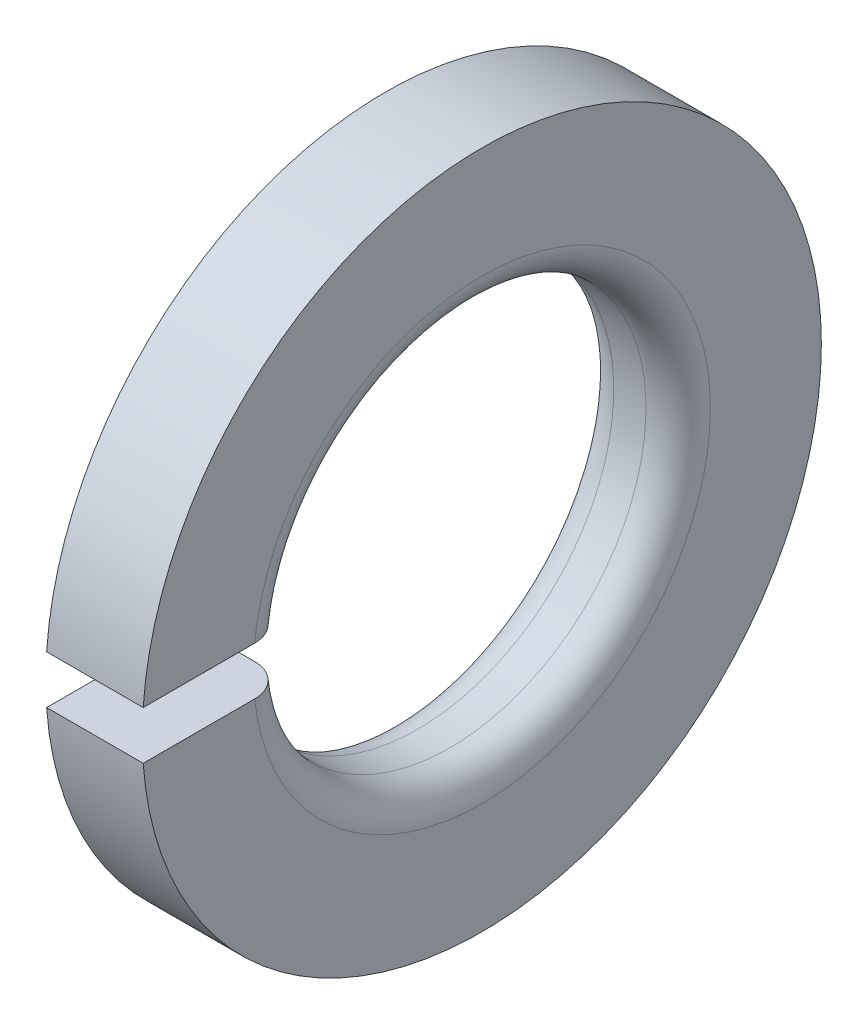
ISO-10303-21;
HEADER;
FILE_DESCRIPTION(('STEP AP214'),'2;1');
FILE_NAME('part.step','',(''),(''),'','','');
FILE_SCHEMA(('AUTOMOTIVE_DESIGN { 1 0 10303 214 1 1 1 1 }'));
ENDSEC;
DATA;
#1=APPLICATION_CONTEXT('core data for automotive mechanical design processes');
#2=APPLICATION_PROTOCOL_DEFINITION('international standard','automotive_design',2000,#1);
#3=PRODUCT_CONTEXT('',#1,'mechanical');
#4=PRODUCT('Part','Part','',(#3));
#5=PRODUCT_RELATED_PRODUCT_CATEGORY('part','',(#4));
#6=PRODUCT_DEFINITION_FORMATION('','',#4);
#7=PRODUCT_DEFINITION_CONTEXT('part definition',#1,'design');
#8=PRODUCT_DEFINITION('design','',#6,#7);
#9=PRODUCT_DEFINITION_SHAPE('','',#8);
#10=(LENGTH_UNIT() NAMED_UNIT(*) SI_UNIT(.MILLI.,.METRE.));
#11=(NAMED_UNIT(*) PLANE_ANGLE_UNIT() SI_UNIT($,.RADIAN.));
#12=(NAMED_UNIT(*) SI_UNIT($,.STERADIAN.) SOLID_ANGLE_UNIT());
#13=UNCERTAINTY_MEASURE_WITH_UNIT(LENGTH_MEASURE(1.E-05),#10,'distance_accuracy_value','');
#14=(GEOMETRIC_REPRESENTATION_CONTEXT(3) GLOBAL_UNCERTAINTY_ASSIGNED_CONTEXT((#13)) GLOBAL_UNIT_ASSIGNED_CONTEXT((#10,
#11,#12)) REPRESENTATION_CONTEXT('',''));
#15=CARTESIAN_POINT('',(0.,0.,0.));
#16=DIRECTION('',(0.,0.,1.));
#17=DIRECTION('',(1.,0.,0.));
#18=AXIS2_PLACEMENT_3D('',#15,#16,#17);
#19=CARTESIAN_POINT('',(-34.925,0.,0.));
#20=DIRECTION('',(-1.,0.,0.));
#21=DIRECTION('',(0.,0.,1.));
#22=AXIS2_PLACEMENT_3D('',#19,#20,#21);
#23=CYLINDRICAL_SURFACE('',#22,10.55);
#24=DIRECTION('',(-1.,0.,0.));
#25=VECTOR('',#24,1.);
#26=CARTESIAN_POINT('',(-34.9250000000012,0.749999999999584,10.5233074648624));
#27=LINE('',#26,#25);
#28=CARTESIAN_POINT('',(0.,0.749999999999917,10.5233074648611));
#29=VERTEX_POINT('',#28);
#30=CARTESIAN_POINT('',(-3.00000000000012,0.750000000000473,10.5233074648618));
#31=VERTEX_POINT('',#30);
#32=EDGE_CURVE('E343',#29,#31,#27,.T.);
#33=ORIENTED_EDGE('',*,*,#32,.F.);
#34=CARTESIAN_POINT('',(0.,0.,0.));
#35=DIRECTION('',(-1.,0.,0.));
#36=DIRECTION('',(0.,0.,1.));
#37=AXIS2_PLACEMENT_3D('',#34,#35,#36);
#38=CIRCLE('',#37,10.55);
#39=CARTESIAN_POINT('',(-8.88178419700125E-13,-0.749999999999695,10.5233074648613));
#40=VERTEX_POINT('',#39);
#41=EDGE_CURVE('E11',#29,#40,#38,.T.);
#42=ORIENTED_EDGE('',*,*,#41,.T.);
#43=DIRECTION('',(1.,0.,0.));
#44=VECTOR('',#43,1.);
#45=CARTESIAN_POINT('',(-34.9250000000012,-0.750000000000029,10.5233074648615));
#46=LINE('',#45,#44);
#47=CARTESIAN_POINT('',(-2.99999999999967,-0.749999999999473,10.5233074648614));
#48=VERTEX_POINT('',#47);
#49=EDGE_CURVE('E342',#48,#40,#46,.T.);
#50=ORIENTED_EDGE('',*,*,#49,.F.);
#51=CARTESIAN_POINT('',(-3.00000000000145,1.66533453693774E-12,1.11022302462516E-13));
#52=DIRECTION('',(-1.,0.,0.));
#53=DIRECTION('',(0.,0.,1.));
#54=AXIS2_PLACEMENT_3D('',#51,#52,#53);
#55=CIRCLE('',#54,10.55);
#56=EDGE_CURVE('E147',#31,#48,#55,.T.);
#57=ORIENTED_EDGE('',*,*,#56,.F.);
#58=EDGE_LOOP('',(#33,#42,#50,#57));
#59=FACE_BOUND('',#58,.T.);
#60=ADVANCED_FACE('F17',(#59),#23,.T.);
#61=CARTESIAN_POINT('',(0.,7.1,1.11022302462516E-13));
#62=DIRECTION('',(-1.,0.,0.));
#63=DIRECTION('',(0.,0.,1.));
#64=AXIS2_PLACEMENT_3D('',#61,#62,#63);
#65=PLANE('',#64);
#66=DIRECTION('',(0.,0.,-1.));
#67=VECTOR('',#66,1.);
#68=CARTESIAN_POINT('',(-8.88178419700125E-13,0.750000000000029,10.761));
#69=LINE('',#68,#67);
#70=CARTESIAN_POINT('',(0.,0.750000000000029,7.06027619856342));
#71=VERTEX_POINT('',#70);
#72=EDGE_CURVE('E352',#29,#71,#69,.T.);
#73=ORIENTED_EDGE('',*,*,#72,.T.);
#74=CARTESIAN_POINT('',(0.,0.,0.));
#75=DIRECTION('',(-1.,0.,0.));
#76=DIRECTION('',(0.,0.,1.));
#77=AXIS2_PLACEMENT_3D('',#74,#75,#76);
#78=CIRCLE('',#77,7.1);
#79=CARTESIAN_POINT('',(0.,-0.749999999999806,7.06027619856287));
#80=VERTEX_POINT('',#79);
#81=EDGE_CURVE('E29',#71,#80,#78,.T.);
#82=ORIENTED_EDGE('',*,*,#81,.T.);
#83=DIRECTION('',(0.,0.,1.));
#84=VECTOR('',#83,1.);
#85=CARTESIAN_POINT('',(0.,-0.749999999999806,0.));
#86=LINE('',#85,#84);
#87=EDGE_CURVE('E115',#80,#40,#86,.T.);
#88=ORIENTED_EDGE('',*,*,#87,.T.);
#89=ORIENTED_EDGE('',*,*,#41,.F.);
#90=EDGE_LOOP('',(#73,#82,#88,#89));
#91=FACE_BOUND('',#90,.T.);
#92=ADVANCED_FACE('F19',(#91),#65,.F.);
#93=CARTESIAN_POINT('',(-1.00000000000122,3.33066907387547E-13,3.33066907387547E-13));
#94=DIRECTION('',(-1.,0.,0.));
#95=DIRECTION('',(0.,0.,1.));
#96=AXIS2_PLACEMENT_3D('',#93,#94,#95);
#97=TOROIDAL_SURFACE('',#96,7.1,1.);
#98=ORIENTED_EDGE('',*,*,#81,.F.);
#99=CARTESIAN_POINT('',(-1.2041149327624E-12,0.750000000000028,7.06027619856342));
#100=CARTESIAN_POINT('',(2.11423307981997E-08,0.750008037936545,7.05364805238839));
#101=CARTESIAN_POINT('',(-6.5138820977953E-05,0.750018129071714,7.04701960641984));
#102=CARTESIAN_POINT('',(-0.000445506639455228,0.750049929015512,7.02767221302381));
#103=CARTESIAN_POINT('',(-0.000935521628921882,0.750073789508414,7.01495631251578));
#104=CARTESIAN_POINT('',(-0.00216099125794257,0.750103964057556,6.9936224435503));
#105=CARTESIAN_POINT('',(-0.00276751760387173,0.750113450510542,6.98499676452231));
#106=CARTESIAN_POINT('',(-0.0043278318197273,0.750130214250066,6.96624579931448));
#107=CARTESIAN_POINT('',(-0.0053239690908946,0.750136808076614,6.95612399142267));
#108=CARTESIAN_POINT('',(-0.00779302574358655,0.750145614820519,6.93440194389385));
#109=CARTESIAN_POINT('',(-0.00931500233512231,0.750147023917739,6.92280726977953));
#110=CARTESIAN_POINT('',(-0.0129844047822201,0.750144554799812,6.89817165380968));
#111=CARTESIAN_POINT('',(-0.0151874654477161,0.750139964242043,6.88513897448243));
#112=CARTESIAN_POINT('',(-0.020385788111291,0.750125385232084,6.85767422063468));
#113=CARTESIAN_POINT('',(-0.023443069404395,0.750114835946151,6.84325386262928));
#114=CARTESIAN_POINT('',(-0.0305331728168089,0.750090038524818,6.81307884826635));
#115=CARTESIAN_POINT('',(-0.0346341302398465,0.750075520931053,6.79734016930507));
#116=CARTESIAN_POINT('',(-0.0440092876829131,0.750045738582378,6.76461623018628));
#117=CARTESIAN_POINT('',(-0.0493573624811857,0.750030531020999,6.74765212400548));
#118=CARTESIAN_POINT('',(-0.0614364981100349,0.750008606357445,6.71259035766385));
#119=CARTESIAN_POINT('',(-0.0682467268683557,0.750002726796111,6.69451985991343));
#120=CARTESIAN_POINT('',(-0.0805636257028954,0.749998139446048,6.66447474261093));
#121=CARTESIAN_POINT('',(-0.085797125781996,0.749997746706142,6.65238725585513));
#122=CARTESIAN_POINT('',(-0.096564212911749,0.74999324765076,6.62879593541076));
#123=CARTESIAN_POINT('',(-0.102083541699873,0.749989256391272,6.61728560510652));
#124=CARTESIAN_POINT('',(-0.113371888865033,0.74998128544142,6.59484584653299));
#125=CARTESIAN_POINT('',(-0.119127351407494,0.749977309433134,6.58390959395909));
#126=CARTESIAN_POINT('',(-0.130840120725573,0.749969864119182,6.56261201264376));
#127=CARTESIAN_POINT('',(-0.136784558829839,0.749966382447419,6.55224360597533));
#128=CARTESIAN_POINT('',(-0.148829677858792,0.749960771596652,6.53207347879412));
#129=CARTESIAN_POINT('',(-0.154918170472224,0.749958600449177,6.52226447788853));
#130=CARTESIAN_POINT('',(-0.167208177496439,0.749955929611172,6.5032028000474));
#131=CARTESIAN_POINT('',(-0.17339817144826,0.749955373780526,6.49394269380808));
#132=CARTESIAN_POINT('',(-0.185850334077228,0.749955987479875,6.47596664955041));
#133=CARTESIAN_POINT('',(-0.192101636110495,0.749957094820871,6.46724318256392));
#134=CARTESIAN_POINT('',(-0.20463794413301,0.74996079457746,6.45032673203549));
#135=CARTESIAN_POINT('',(-0.21091272110423,0.749963329204107,6.44212616650714));
#136=CARTESIAN_POINT('',(-0.223459865779099,0.749969393821079,6.42624056403475));
#137=CARTESIAN_POINT('',(-0.229722624155955,0.749972880748052,6.41854793584713));
#138=CARTESIAN_POINT('',(-0.242211926815478,0.749980134744804,6.40366223906435));
#139=CARTESIAN_POINT('',(-0.248429462668517,0.749983884508126,6.39646161038275));
#140=CARTESIAN_POINT('',(-0.260796819415206,0.74999075578992,6.38254311618097));
#141=CARTESIAN_POINT('',(-0.266938211030566,0.749993897287116,6.37581776104531));
#142=CARTESIAN_POINT('',(-0.279123861359696,0.749998464356577,6.3628325533268));
#143=CARTESIAN_POINT('',(-0.285160254244034,0.749999960151965,6.35656531170203));
#144=CARTESIAN_POINT('',(-0.299781099102845,0.750000055397179,6.34177533362768));
#145=CARTESIAN_POINT('',(-0.308440744744657,0.749997296983446,6.33332670620505));
#146=CARTESIAN_POINT('',(-0.325986854869242,0.749987542607557,6.31681723310449));
#147=CARTESIAN_POINT('',(-0.334870841593646,0.749980581990885,6.30875375180008));
#148=CARTESIAN_POINT('',(-0.352847247959955,0.749963712506177,6.29301694327239));
#149=CARTESIAN_POINT('',(-0.361937306871138,0.749953828749099,6.28534091982272));
#150=CARTESIAN_POINT('',(-0.380307533792174,0.749932274552667,6.27038077865991));
#151=CARTESIAN_POINT('',(-0.389585460080683,0.749920619838264,6.26309390794446));
#152=CARTESIAN_POINT('',(-0.408313440867343,0.749896541627526,6.24891296706047));
#153=CARTESIAN_POINT('',(-0.417761372334003,0.749884125477424,6.24201609304799));
#154=CARTESIAN_POINT('',(-0.436811688573136,0.749859405250485,6.22861528610179));
#155=CARTESIAN_POINT('',(-0.446412069008523,0.749847101120888,6.22210850371771));
#156=CARTESIAN_POINT('',(-0.465749958551137,0.749823349867244,6.20948727984532));
#157=CARTESIAN_POINT('',(-0.475485581657837,0.74981189629012,6.20336994857705));
#158=CARTESIAN_POINT('',(-0.495077002164332,0.749790458163845,6.19152632362359));
#159=CARTESIAN_POINT('',(-0.504931031375656,0.749780461763541,6.18579710494295));
#160=CARTESIAN_POINT('',(-0.524742703631445,0.74976242001739,6.17472773027463));
#161=CARTESIAN_POINT('',(-0.534698695568911,0.749754358429363,6.16938461907566));
#162=CARTESIAN_POINT('',(-0.554698146737854,0.749740541645805,6.15908484623193));
#163=CARTESIAN_POINT('',(-0.564740071030225,0.749734766825856,6.15412520402685));
#164=CARTESIAN_POINT('',(-0.584895672640169,0.749725755765443,6.14458915068896));
#165=CARTESIAN_POINT('',(-0.59500793009622,0.749722497527077,6.14000973838084));
#166=CARTESIAN_POINT('',(-0.615288932272613,0.749718632443541,6.1312303539494));
#167=CARTESIAN_POINT('',(-0.62545637095254,0.749718002233714,6.12702736463286));
#168=CARTESIAN_POINT('',(-0.64583293264701,0.749719390631004,6.11899649562263));
#169=CARTESIAN_POINT('',(-0.656040862028827,0.749721385509608,6.11516558717549));
#170=CARTESIAN_POINT('',(-0.676484077465172,0.749727910284104,6.10787404214419));
#171=CARTESIAN_POINT('',(-0.686718280733683,0.749732417084971,6.10441036956231));
#172=CARTESIAN_POINT('',(-0.707200202174703,0.749743745006644,6.09784798343645));
#173=CARTESIAN_POINT('',(-0.717446946708477,0.749750544656072,6.09474623082294));
#174=CARTESIAN_POINT('',(-0.737940603683841,0.74976613513961,6.08890192845629));
#175=CARTESIAN_POINT('',(-0.748186649805068,0.749774907107453,6.08615634058943));
#176=CARTESIAN_POINT('',(-0.768666064936576,0.749794021233457,6.08101819942575));
#177=CARTESIAN_POINT('',(-0.778898672995217,0.749804348101752,6.07862261285264));
#178=CARTESIAN_POINT('',(-0.799338874556187,0.749826057824054,6.07417792451807));
#179=CARTESIAN_POINT('',(-0.809545810413815,0.749837429924567,6.07212579805322));
#180=CARTESIAN_POINT('',(-0.829922841778302,0.749860627495553,6.06836112891827));
#181=CARTESIAN_POINT('',(-0.840092380781704,0.749872447695563,6.0666455737052));
#182=CARTESIAN_POINT('',(-0.860383306856754,0.74989585499694,6.06354682372122));
#183=CARTESIAN_POINT('',(-0.870504236305252,0.749907443245808,6.0621606320133));
#184=CARTESIAN_POINT('',(-0.89068714727635,0.749929621988156,6.05971309388315));
#185=CARTESIAN_POINT('',(-0.900748767705977,0.74994022095905,6.05864876941193));
#186=CARTESIAN_POINT('',(-0.920802779557631,0.749959580027983,6.05683718006757));
#187=CARTESIAN_POINT('',(-0.930794903992257,0.749968356859051,6.05608695923404));
#188=CARTESIAN_POINT('',(-0.950700158460559,0.74998317033175,6.05489557274971));
#189=CARTESIAN_POINT('',(-0.960613113094895,0.749989232760618,6.05445147604589));
#190=CARTESIAN_POINT('',(-0.980350767955612,0.749997618688641,6.05386405048746));
#191=CARTESIAN_POINT('',(-0.990175381863722,0.749999978218759,6.05371781904315));
#192=CARTESIAN_POINT('',(-1.00000000000121,0.749999999999889,6.05371786590726));
#193=B_SPLINE_CURVE_WITH_KNOTS('',3,(#99,#100,#101,#102,#103,#104,#105,#106,#107,#108,#109,#110,
#111,#112,#113,#114,#115,#116,#117,#118,#119,#120,#121,#122,#123,#124,#125,#126,#127,#128,#129,
#130,#131,#132,#133,#134,#135,#136,#137,#138,#139,#140,#141,#142,#143,#144,#145,#146,#147,#148,
#149,#150,#151,#152,#153,#154,#155,#156,#157,#158,#159,#160,#161,#162,#163,#164,#165,#166,#167,
#168,#169,#170,#171,#172,#173,#174,#175,#176,#177,#178,#179,#180,#181,#182,#183,#184,#185,#186,
#187,#188,#189,#190,#191,#192),.UNSPECIFIED.,.F.,.F.,(4,2,2,2,2,2,2,2,2,2,2,2,2,2,2,2,2,2,2,2,2,
2,2,2,2,2,2,2,2,2,2,2,2,2,2,2,2,2,2,2,2,2,2,2,2,2,4),(0.,0.0198848844077795,0.05805079897902,
0.083989284224621,0.114496655421104,0.149572083118762,0.189214626023075,0.233423238921282,
0.282196783078135,0.335534039528537,0.393433725662494,0.432939987603925,0.47122622993429,
0.508292782305171,0.544139958379165,0.578768056426907,0.612177360131367,0.644368139593511,
0.675340652539823,0.705095145740162,0.733631856654177,0.760951015337154,0.787052846652623,
0.823339391841095,0.859324895904127,0.895009830030772,0.930394655814464,0.965479825985928,
1.00026578519895,1.03475297086513,1.06894181403409,1.10283274031573,1.13642617084169,
1.16972252326329,1.20272221278343,1.23542565322055,1.26783325810255,1.29994544178923,
1.33176262062186,1.36328521409865,1.39451364607533,1.42544834599017,1.45608975011279,
1.48643830281662,1.51649445787486,1.54625867977995,1.57573144508685),.UNSPECIFIED.);
#194=CARTESIAN_POINT('',(-1.00000000000078,0.749999999999806,6.05371786590658));
#195=VERTEX_POINT('',#194);
#196=EDGE_CURVE('E91',#71,#195,#193,.T.);
#197=ORIENTED_EDGE('',*,*,#196,.T.);
#198=CARTESIAN_POINT('',(-1.00000000000122,3.33066907387547E-13,3.33066907387547E-13));
#199=DIRECTION('',(-1.,0.,0.));
#200=DIRECTION('',(0.,0.,1.));
#201=AXIS2_PLACEMENT_3D('',#198,#199,#200);
#202=CIRCLE('',#201,6.1);
#203=CARTESIAN_POINT('',(-0.99999999999989,-0.749999999999584,6.05371786590669));
#204=VERTEX_POINT('',#203);
#205=EDGE_CURVE('E84',#195,#204,#202,.T.);
#206=ORIENTED_EDGE('',*,*,#205,.T.);
#207=CARTESIAN_POINT('',(-1.00000000000122,-0.749999999999655,6.0537178659072));
#208=CARTESIAN_POINT('',(-0.98864580629994,-0.74999983871679,6.0537177933391));
#209=CARTESIAN_POINT('',(-0.977291637226825,-0.74998842317375,6.05391415055511));
#210=CARTESIAN_POINT('',(-0.954273521757971,-0.749947517721484,6.05470961881993));
#211=CARTESIAN_POINT('',(-0.94260996621021,-0.74991752211604,6.0553200454697));
#212=CARTESIAN_POINT('',(-0.918988745261551,-0.749843455769734,6.05697637438166));
#213=CARTESIAN_POINT('',(-0.907031894416854,-0.749799017737892,6.05803388469803));
#214=CARTESIAN_POINT('',(-0.88284215737576,-0.749699769780837,6.06061725344128));
#215=CARTESIAN_POINT('',(-0.870610540241056,-0.749644712091877,6.06215499242686));
#216=CARTESIAN_POINT('',(-0.845891924764115,-0.749527905027171,6.06573182138134));
#217=CARTESIAN_POINT('',(-0.833406682218283,-0.749466017627301,6.06778304605382));
#218=CARTESIAN_POINT('',(-0.808204168231223,-0.749339089359824,6.07241976557473));
#219=CARTESIAN_POINT('',(-0.79548917141209,-0.749274008323552,6.07501762733141));
#220=CARTESIAN_POINT('',(-0.769853323980096,-0.749144077073757,6.08078027405549));
#221=CARTESIAN_POINT('',(-0.756935298937043,-0.749079273509318,6.08395763384425));
#222=CARTESIAN_POINT('',(-0.730922504553121,-0.748953083411957,6.09091144912769));
#223=CARTESIAN_POINT('',(-0.717831143562997,-0.748891819271141,6.0947006602152));
#224=CARTESIAN_POINT('',(-0.691503822617773,-0.748775658789017,6.10290964108203));
#225=CARTESIAN_POINT('',(-0.678271885134138,-0.748720949641896,6.10734231721819));
#226=CARTESIAN_POINT('',(-0.651698680210438,-0.748620573250317,6.11686873307185));
#227=CARTESIAN_POINT('',(-0.638362079954005,-0.74857514709261,6.12197549690525));
#228=CARTESIAN_POINT('',(-0.611618014554271,-0.748495692259896,6.13287936815752));
#229=CARTESIAN_POINT('',(-0.59821589088877,-0.748461947670379,6.13868958136597));
#230=CARTESIAN_POINT('',(-0.571382494288149,-0.748407849956561,6.15102812136404));
#231=CARTESIAN_POINT('',(-0.557957265417688,-0.748387813010919,6.15756959637456));
#232=CARTESIAN_POINT('',(-0.5311226587416,-0.748362719213466,6.17139661708041));
#233=CARTESIAN_POINT('',(-0.517720054295375,-0.748357999703219,6.1786953109725));
#234=CARTESIAN_POINT('',(-0.490978992823964,-0.748364679895013,6.19406059369174));
#235=CARTESIAN_POINT('',(-0.477648063264032,-0.748376427140605,6.20214028498603));
#236=CARTESIAN_POINT('',(-0.451101929769764,-0.748416686307562,6.219088917855));
#237=CARTESIAN_POINT('',(-0.437895029993027,-0.748445544985654,6.2279708671976));
#238=CARTESIAN_POINT('',(-0.411651773796662,-0.748520135128423,6.24654255172851));
#239=CARTESIAN_POINT('',(-0.398624518245661,-0.748566201557073,6.25624514776224));
#240=CARTESIAN_POINT('',(-0.372798534587934,-0.74867473519741,6.27647347735246));
#241=CARTESIAN_POINT('',(-0.360009721154046,-0.748737514576063,6.28701186939311));
#242=CARTESIAN_POINT('',(-0.334721665455284,-0.748878380706492,6.3089235833416));
#243=CARTESIAN_POINT('',(-0.322233165464315,-0.748956745852301,6.3203093027859));
#244=CARTESIAN_POINT('',(-0.297609697050328,-0.749127029457294,6.34392352013707));
#245=CARTESIAN_POINT('',(-0.285486308619727,-0.749219181624383,6.35616409300119));
#246=CARTESIAN_POINT('',(-0.261659758676289,-0.749414587988212,6.38149153096655));
#247=CARTESIAN_POINT('',(-0.249969020921282,-0.74951802039829,6.39459008390115));
#248=CARTESIAN_POINT('',(-0.227076979280183,-0.749732805496878,6.42163226756731));
#249=CARTESIAN_POINT('',(-0.215888944487963,-0.749844270249991,6.43558713174588));
#250=CARTESIAN_POINT('',(-0.194073761385874,-0.750071178593424,6.46433559803284));
#251=CARTESIAN_POINT('',(-0.18346072421577,-0.75018665765646,6.4791399093657));
#252=CARTESIAN_POINT('',(-0.162868918608845,-0.750416869027542,6.50957542648567));
#253=CARTESIAN_POINT('',(-0.152905094721666,-0.750531550048422,6.52521674540462));
#254=CARTESIAN_POINT('',(-0.133686680028679,-0.750754636575202,6.55730850294329));
#255=CARTESIAN_POINT('',(-0.124447853089308,-0.750862894210995,6.57376838396255));
#256=CARTESIAN_POINT('',(-0.106755519575408,-0.751066789472104,6.60747336634217));
#257=CARTESIAN_POINT('',(-0.0983185751261912,-0.751162173246847,6.62472716626195));
#258=CARTESIAN_POINT('',(-0.0823069456142083,-0.75133315426702,6.65998893905314));
#259=CARTESIAN_POINT('',(-0.0747495967010599,-0.75140838277962,6.67800478063059));
#260=CARTESIAN_POINT('',(-0.0605737127423072,-0.751531069068705,6.71475469007459));
#261=CARTESIAN_POINT('',(-0.05397324434781,-0.751578034961652,6.73349575430329));
#262=CARTESIAN_POINT('',(-0.0448728743489909,-0.751620879562432,6.76199054461998));
#263=CARTESIAN_POINT('',(-0.0419573013597912,-0.751630532526885,6.77161344799397));
#264=CARTESIAN_POINT('',(-0.0363917836117022,-0.751639438311981,6.79102197072051));
#265=CARTESIAN_POINT('',(-0.0337442254519466,-0.751638604784668,6.80080827747886));
#266=CARTESIAN_POINT('',(-0.0287243500696292,-0.751625306293998,6.82053635999511));
#267=CARTESIAN_POINT('',(-0.0263544605161404,-0.751612746276144,6.83047875267798));
#268=CARTESIAN_POINT('',(-0.0218992256184353,-0.751574717062077,6.85051179051689));
#269=CARTESIAN_POINT('',(-0.0198163455662395,-0.751549143929064,6.860602983997));
#270=CARTESIAN_POINT('',(-0.0159443614924018,-0.751483763934985,6.88092577645207));
#271=CARTESIAN_POINT('',(-0.0141577589600181,-0.751443844081356,6.89115785164749));
#272=CARTESIAN_POINT('',(-0.0108873963769306,-0.751348401094122,6.91175410295445));
#273=CARTESIAN_POINT('',(-0.00940617187817779,-0.751292755758254,6.92211868116628));
#274=CARTESIAN_POINT('',(-0.00675546421118098,-0.751164448554747,6.94297112413655));
#275=CARTESIAN_POINT('',(-0.00558854856794579,-0.751091655136036,6.95345931450315));
#276=CARTESIAN_POINT('',(-0.00357515205865328,-0.750927596990774,6.97454966762675));
#277=CARTESIAN_POINT('',(-0.00273126836363284,-0.750836191246432,6.98515207727583));
#278=CARTESIAN_POINT('',(-0.00137243174301712,-0.750633412380971,7.00646104952574));
#279=CARTESIAN_POINT('',(-0.000860103436216422,-0.750521888662672,7.01716777810018));
#280=CARTESIAN_POINT('',(-0.000172531204949979,-0.750277344787925,7.03867506310187));
#281=CARTESIAN_POINT('',(6.39148179182057E-08,-0.750144164410005,7.04947570244256));
#282=CARTESIAN_POINT('',(-1.21625799709424E-12,-0.749999999999783,7.06027619856287));
#283=B_SPLINE_CURVE_WITH_KNOTS('',3,(#207,#208,#209,#210,#211,#212,#213,#214,#215,#216,#217,
#218,#219,#220,#221,#222,#223,#224,#225,#226,#227,#228,#229,#230,#231,#232,#233,#234,#235,#236,
#237,#238,#239,#240,#241,#242,#243,#244,#245,#246,#247,#248,#249,#250,#251,#252,#253,#254,#255,
#256,#257,#258,#259,#260,#261,#262,#263,#264,#265,#266,#267,#268,#269,#270,#271,#272,#273,#274,
#275,#276,#277,#278,#279,#280,#281,#282),.UNSPECIFIED.,.F.,.F.,(4,2,2,2,2,2,2,2,2,2,2,2,2,2,2,2,
2,2,2,2,2,2,2,2,2,2,2,2,2,2,2,2,2,2,2,2,2,4),(0.,0.0340608671438252,0.0690921739297636,
0.105095047553634,0.142070531482574,0.180019597389751,0.218943155998405,0.258842066994336,
0.299717148137715,0.341569183681301,0.384398932182066,0.428207133775896,0.472994516969988,
0.518761804994251,0.565509721740984,0.613238997311195,0.661950373175653,0.711644606949192,
0.762322476767458,0.813984785246514,0.866632362996905,0.9202660716555,0.974886806390267,
1.03049549782532,1.08709311332638,1.14468065758018,1.2032591723955,1.26282973564916,
1.2929907476529,1.32340027313667,1.35405845725087,1.38496544685101,1.41612139034258,
1.44752643750698,1.47918073930796,1.51108444767819,1.5432377152853,1.57564069527726),.UNSPECIFIED.);
#284=EDGE_CURVE('E90',#204,#80,#283,.T.);
#285=ORIENTED_EDGE('',*,*,#284,.T.);
#286=EDGE_LOOP('',(#98,#197,#206,#285));
#287=FACE_BOUND('',#286,.T.);
#288=ADVANCED_FACE('F87',(#287),#97,.T.);
#289=CARTESIAN_POINT('',(-34.925,0.,0.));
#290=DIRECTION('',(-1.,0.,0.));
#291=DIRECTION('',(0.,0.,1.));
#292=AXIS2_PLACEMENT_3D('',#289,#290,#291);
#293=CYLINDRICAL_SURFACE('',#292,6.1);
#294=DIRECTION('',(1.,0.,0.));
#295=VECTOR('',#294,1.);
#296=CARTESIAN_POINT('',(-34.925,0.74999999999914,6.05371786590791));
#297=LINE('',#296,#295);
#298=CARTESIAN_POINT('',(-1.99999999999978,0.749999999999362,6.05371786590725));
#299=VERTEX_POINT('',#298);
#300=EDGE_CURVE('E386',#299,#195,#297,.T.);
#301=ORIENTED_EDGE('',*,*,#300,.F.);
#302=CARTESIAN_POINT('',(-1.99999999999978,-1.11022302462516E-13,0.));
#303=DIRECTION('',(-1.,0.,0.));
#304=DIRECTION('',(0.,0.,1.));
#305=AXIS2_PLACEMENT_3D('',#302,#303,#304);
#306=CIRCLE('',#305,6.1);
#307=CARTESIAN_POINT('',(-1.99999999999978,-0.749999999999251,6.05371786590703));
#308=VERTEX_POINT('',#307);
#309=EDGE_CURVE('E97',#299,#308,#306,.T.);
#310=ORIENTED_EDGE('',*,*,#309,.T.);
#311=DIRECTION('',(-1.,0.,0.));
#312=VECTOR('',#311,1.);
#313=CARTESIAN_POINT('',(-34.925,-0.750000000000473,6.05371786590725));
#314=LINE('',#313,#312);
#315=EDGE_CURVE('E105',#204,#308,#314,.T.);
#316=ORIENTED_EDGE('',*,*,#315,.F.);
#317=ORIENTED_EDGE('',*,*,#205,.F.);
#318=EDGE_LOOP('',(#301,#310,#316,#317));
#319=FACE_BOUND('',#318,.T.);
#320=ADVANCED_FACE('F103',(#319),#293,.F.);
#321=CARTESIAN_POINT('',(-1.99999999999978,-1.11022302462516E-13,0.));
#322=DIRECTION('',(-1.,0.,0.));
#323=DIRECTION('',(0.,0.,1.));
#324=AXIS2_PLACEMENT_3D('',#321,#322,#323);
#325=TOROIDAL_SURFACE('',#324,7.1,1.);
#326=ORIENTED_EDGE('',*,*,#309,.F.);
#327=CARTESIAN_POINT('',(-1.99999999999976,0.749999999999323,6.05371786590694));
#328=CARTESIAN_POINT('',(-2.0113541054558,0.749999838710264,6.05371779334219));
#329=CARTESIAN_POINT('',(-2.02270818628288,0.749988422777934,6.05391414757511));
#330=CARTESIAN_POINT('',(-2.04572613126002,0.749947515865038,6.05470960401803));
#331=CARTESIAN_POINT('',(-2.05738960456086,0.749917519156536,6.05532002194772));
#332=CARTESIAN_POINT('',(-2.08101066731561,0.749843449971043,6.05697632792611));
#333=CARTESIAN_POINT('',(-2.09296744220996,0.749799010177872,6.05803382415804));
#334=CARTESIAN_POINT('',(-2.11715703393793,0.74969975811248,6.06061715965363));
#335=CARTESIAN_POINT('',(-2.12938858170356,0.74964469805681,6.06215487961545));
#336=CARTESIAN_POINT('',(-2.15410706529941,0.749527885730235,6.0657316659041));
#337=CARTESIAN_POINT('',(-2.16659224532304,0.749465995420604,6.06778286708436));
#338=CARTESIAN_POINT('',(-2.19179464136843,0.74933906086855,6.07241953551002));
#339=CARTESIAN_POINT('',(-2.20450958275303,0.749273976447454,6.07501736982381));
#340=CARTESIAN_POINT('',(-2.23014532663452,0.749144038033052,6.08077995810426));
#341=CARTESIAN_POINT('',(-2.24306330354059,0.749079230682996,6.08395728706256));
#342=CARTESIAN_POINT('',(-2.26907600914879,0.748953032695495,6.0909110377241));
#343=CARTESIAN_POINT('',(-2.28216732947214,0.748891764448096,6.0947002152003));
#344=CARTESIAN_POINT('',(-2.30849457671928,0.748775595515412,6.10290912652195));
#345=CARTESIAN_POINT('',(-2.3217264811354,0.74872088202566,6.10734176691389));
#346=CARTESIAN_POINT('',(-2.34829962764783,0.748620496797634,6.11686810963343));
#347=CARTESIAN_POINT('',(-2.36163620251498,0.748575066150509,6.12197483627566));
#348=CARTESIAN_POINT('',(-2.38838022489288,0.748495602277978,6.13287863221149));
#349=CARTESIAN_POINT('',(-2.40178233086978,0.748461853145176,6.13868880750194));
#350=CARTESIAN_POINT('',(-2.4286156998212,0.748407746377055,6.15102727147154));
#351=CARTESIAN_POINT('',(-2.44204091866332,0.7483877049299,6.15756870858675));
#352=CARTESIAN_POINT('',(-2.46887551291414,0.74836260225701,6.17139565407586));
#353=CARTESIAN_POINT('',(-2.48227811488281,0.748357878384417,6.17869431086874));
#354=CARTESIAN_POINT('',(-2.5090191788602,0.7483645500754,6.19405952074809));
#355=CARTESIAN_POINT('',(-2.52235011330896,0.748376293195865,6.20213917653012));
#356=CARTESIAN_POINT('',(-2.54889626379239,0.748416544432542,6.21908774052891));
#357=CARTESIAN_POINT('',(-2.56210317555954,0.74844539932026,6.22796965674714));
#358=CARTESIAN_POINT('',(-2.58834646261438,0.748519982296831,6.2465412779825));
#359=CARTESIAN_POINT('',(-2.60137373690718,0.748566045365562,6.25624384408256));
#360=CARTESIAN_POINT('',(-2.62719976450369,0.748674572792322,6.27647211755152));
#361=CARTESIAN_POINT('',(-2.6399886029909,0.748737349334033,6.28701048364471));
#362=CARTESIAN_POINT('',(-2.66527671473672,0.748878210384236,6.30892215022139));
#363=CARTESIAN_POINT('',(-2.67776524555939,0.74895657330397,6.32030784848265));
#364=CARTESIAN_POINT('',(-2.70238878096749,0.74912685313205,6.34392202874117));
#365=CARTESIAN_POINT('',(-2.71451220537916,0.749219003765682,6.35616258593659));
#366=CARTESIAN_POINT('',(-2.73833883190912,0.74941440781206,6.38148999855007));
#367=CARTESIAN_POINT('',(-2.75002961006813,0.749517839455373,6.39458854204023));
#368=CARTESIAN_POINT('',(-2.77292173633815,0.749732623835189,6.4216307134646));
#369=CARTESIAN_POINT('',(-2.78410981513307,0.749844088653045,6.43558557508049));
#370=CARTESIAN_POINT('',(-2.80592508916177,0.75007099799553,6.46433404348705));
#371=CARTESIAN_POINT('',(-2.81653817301225,0.750186478008821,6.4791383597308));
#372=CARTESIAN_POINT('',(-2.83713007390759,0.750416692192746,6.50957389443836));
#373=CARTESIAN_POINT('',(-2.84709394613757,0.750531375091027,6.52521522625438));
#374=CARTESIAN_POINT('',(-2.86631245836028,0.750754466314172,6.55730701778235));
#375=CARTESIAN_POINT('',(-2.87555133419945,0.750862726782285,6.57376692010369));
#376=CARTESIAN_POINT('',(-2.89324376518987,0.75106662866393,6.60747195360768));
#377=CARTESIAN_POINT('',(-2.90168075790682,0.751162016238472,6.62472578354676));
#378=CARTESIAN_POINT('',(-2.91769248238575,0.751333005812041,6.65998762509759));
#379=CARTESIAN_POINT('',(-2.92524987766742,0.751408239087733,6.67800350559685));
#380=CARTESIAN_POINT('',(-2.93942585148973,0.751530935838031,6.7147535016898));
#381=CARTESIAN_POINT('',(-2.94602636302761,0.751577907436216,6.7334946138098));
#382=CARTESIAN_POINT('',(-2.95512679376906,0.751620761225934,6.76198948050552));
#383=CARTESIAN_POINT('',(-2.95804238666625,0.751630417379876,6.7716124111137));
#384=CARTESIAN_POINT('',(-2.96360794294977,0.751639329762115,6.79102099048194));
#385=CARTESIAN_POINT('',(-2.96625551968924,0.751638499642831,6.80080732666433));
#386=CARTESIAN_POINT('',(-2.9712754307704,0.751625208178358,6.82053547016182));
#387=CARTESIAN_POINT('',(-2.97364533739406,0.751612651778857,6.83047789441685));
#388=CARTESIAN_POINT('',(-2.97810060479262,0.75157463000256,6.85051099748675));
#389=CARTESIAN_POINT('',(-2.98018350022539,0.751549060688953,6.8606022246391));
#390=CARTESIAN_POINT('',(-2.9840555132403,0.751483688524369,6.88092508646624));
#391=CARTESIAN_POINT('',(-2.98584212928197,0.751443772680615,6.89115719737324));
#392=CARTESIAN_POINT('',(-2.98911251688283,0.751348337892195,6.9117535220606));
#393=CARTESIAN_POINT('',(-2.99059375283781,0.751292696744842,6.92211813795125));
#394=CARTESIAN_POINT('',(-2.99324448123596,0.751164398084582,6.94297065815401));
#395=CARTESIAN_POINT('',(-2.99441140610085,0.751091609019964,6.95345888808246));
#396=CARTESIAN_POINT('',(-2.99642481869276,0.750927559735,6.97454932210998));
#397=CARTESIAN_POINT('',(-2.99726870919452,0.750836158496001,6.9851517731074));
#398=CARTESIAN_POINT('',(-2.99862755688978,0.750633388778005,7.00646082972714));
#399=CARTESIAN_POINT('',(-2.99913988940939,0.750521869700737,7.01716760132734));
#400=CARTESIAN_POINT('',(-2.99982746735321,0.750277335228344,7.0386749739338));
#401=CARTESIAN_POINT('',(-3.00000006391686,0.750144159610421,7.0494756578557));
#402=CARTESIAN_POINT('',(-2.99999999999976,0.750000000000028,7.06027619856342));
#403=B_SPLINE_CURVE_WITH_KNOTS('',3,(#327,#328,#329,#330,#331,#332,#333,#334,#335,#336,#337,
#338,#339,#340,#341,#342,#343,#344,#345,#346,#347,#348,#349,#350,#351,#352,#353,#354,#355,#356,
#357,#358,#359,#360,#361,#362,#363,#364,#365,#366,#367,#368,#369,#370,#371,#372,#373,#374,#375,
#376,#377,#378,#379,#380,#381,#382,#383,#384,#385,#386,#387,#388,#389,#390,#391,#392,#393,#394,
#395,#396,#397,#398,#399,#400,#401,#402),.UNSPECIFIED.,.F.,.F.,(4,2,2,2,2,2,2,2,2,2,2,2,2,2,2,2,
2,2,2,2,2,2,2,2,2,2,2,2,2,2,2,2,2,2,2,2,2,4),(0.,0.0340606024450023,0.0690916616201709,
0.105094304726688,0.142069575234467,0.180018444817314,0.218941824197329,0.258840573057701,
0.299715509154754,0.341567416736379,0.384397054353823,0.428205162136529,0.472992468584666,
0.518759696920615,0.565507571028747,0.613236821001806,0.661948188302045,0.711642430535564,
0.762320325829139,0.813982676789843,0.866630314019174,0.920264099144938,0.974884927326035,
1.03049372917756,1.08709147205629,1.14467916064006,1.20325783672889,1.26282857819092,
1.29298968567888,1.32339931087935,1.35405759894173,1.38496469672052,1.41612075262022,
1.44752591642121,1.47918033908625,1.511084172547,1.5432375694701,1.57564068300247),.UNSPECIFIED.);
#404=CARTESIAN_POINT('',(-3.00000000000012,0.750000000000029,7.06027619856342));
#405=VERTEX_POINT('',#404);
#406=EDGE_CURVE('E351',#299,#405,#403,.T.);
#407=ORIENTED_EDGE('',*,*,#406,.T.);
#408=CARTESIAN_POINT('',(-3.00000000000145,1.66533453693774E-12,1.11022302462516E-13));
#409=DIRECTION('',(-1.,0.,0.));
#410=DIRECTION('',(0.,0.,1.));
#411=AXIS2_PLACEMENT_3D('',#408,#409,#410);
#412=CIRCLE('',#411,7.1);
#413=CARTESIAN_POINT('',(-2.99999999999967,-0.749999999998696,7.06027619856409));
#414=VERTEX_POINT('',#413);
#415=EDGE_CURVE('E43',#405,#414,#412,.T.);
#416=ORIENTED_EDGE('',*,*,#415,.T.);
#417=CARTESIAN_POINT('',(-2.99999999999977,-0.749999999998664,7.06027619856409));
#418=CARTESIAN_POINT('',(-3.00000002116066,-0.750008035089793,7.05364618456181));
#419=CARTESIAN_POINT('',(-2.99993482445155,-0.75001812498465,7.04701587060708));
#420=CARTESIAN_POINT('',(-2.99955429706547,-0.750049918782487,7.02766581763823));
#421=CARTESIAN_POINT('',(-2.99906416602456,-0.75007377496732,7.01494912648151));
#422=CARTESIAN_POINT('',(-2.99783848268225,-0.750103942803899,6.99361448010651));
#423=CARTESIAN_POINT('',(-2.99723188867034,-0.750113426781459,6.98498881147973));
#424=CARTESIAN_POINT('',(-2.99567144984649,-0.750130185709643,6.96623813725268));
#425=CARTESIAN_POINT('',(-2.99467526375247,-0.750136777473278,6.95611660961142));
#426=CARTESIAN_POINT('',(-2.99220614573845,-0.750145580902476,6.93439539072115));
#427=CARTESIAN_POINT('',(-2.99068416712438,-0.750146989057622,6.92280126415696));
#428=CARTESIAN_POINT('',(-2.9870148294888,-0.750144519316409,6.89816700652358));
#429=CARTESIAN_POINT('',(-2.98481184852906,-0.750139929353124,6.88513513638521));
#430=CARTESIAN_POINT('',(-2.97961379337096,-0.750125353037734,6.85767225504922));
#431=CARTESIAN_POINT('',(-2.97655671503548,-0.75011480607481,6.84325295770328));
#432=CARTESIAN_POINT('',(-2.96946717098431,-0.750090014531858,6.81308030397571));
#433=CARTESIAN_POINT('',(-2.96536658730335,-0.750075500612103,6.79734292091977));
#434=CARTESIAN_POINT('',(-2.9559923813524,-0.750045726065614,6.76462179055294));
#435=CARTESIAN_POINT('',(-2.95064490366214,-0.750030522625551,6.74765919134528));
#436=CARTESIAN_POINT('',(-2.93856722106227,-0.75000860409314,6.71260062471219));
#437=CARTESIAN_POINT('',(-2.93175786940772,-0.750002726249975,6.69453181166134));
#438=CARTESIAN_POINT('',(-2.91944232688806,-0.749998139713394,6.66448875887819));
#439=CARTESIAN_POINT('',(-2.9142092275579,-0.749997746860828,6.65240168920199));
#440=CARTESIAN_POINT('',(-2.90344296945585,-0.749993248188819,6.62881117668016));
#441=CARTESIAN_POINT('',(-2.89792406830577,-0.74998925741022,6.61730123778599));
#442=CARTESIAN_POINT('',(-2.88663660072498,-0.749981287433553,6.59486223542559));
#443=CARTESIAN_POINT('',(-2.88088158952857,-0.749977311916956,6.58392634825935));
#444=CARTESIAN_POINT('',(-2.86916974419546,-0.749969867572599,6.56262947123333));
#445=CARTESIAN_POINT('',(-2.86322577816786,-0.749966386378399,6.55226140407988));
#446=CARTESIAN_POINT('',(-2.85118162168012,-0.749960776346428,6.53209192970519));
#447=CARTESIAN_POINT('',(-2.84509361900728,-0.749958605542982,6.52228324275028));
#448=CARTESIAN_POINT('',(-2.83280460749645,-0.749955935206595,6.50322216713908));
#449=CARTESIAN_POINT('',(-2.8266151186309,-0.749955379537794,6.49396234985976));
#450=CARTESIAN_POINT('',(-2.81416397920082,-0.749955993350106,6.4759868586144));
#451=CARTESIAN_POINT('',(-2.80791319483012,-0.74995710064745,6.46726365637905));
#452=CARTESIAN_POINT('',(-2.7953779327103,-0.749960800116758,6.45034771140111));
#453=CARTESIAN_POINT('',(-2.78910368356435,-0.749963334505157,6.44214738738556));
#454=CARTESIAN_POINT('',(-2.77655760282741,-0.74996939848506,6.42626224511123));
#455=CARTESIAN_POINT('',(-2.7702953801821,-0.749972885018041,6.41856983633374));
#456=CARTESIAN_POINT('',(-2.7578071551445,-0.749980138135975,6.40368455681792));
#457=CARTESIAN_POINT('',(-2.75159016083271,-0.749983887417898,6.39648412672635));
#458=CARTESIAN_POINT('',(-2.73922389135089,-0.749990757731307,6.38256600954663));
#459=CARTESIAN_POINT('',(-2.73308304514049,-0.749993898743197,6.37584083358218));
#460=CARTESIAN_POINT('',(-2.72089848800404,-0.749998464977109,6.36285596557628));
#461=CARTESIAN_POINT('',(-2.71486264261609,-0.749999960420064,6.35658888523428));
#462=CARTESIAN_POINT('',(-2.70024220540545,-0.750000055029903,6.34179833707175));
#463=CARTESIAN_POINT('',(-2.69158239244195,-0.749997295805008,6.3333490003599));
#464=CARTESIAN_POINT('',(-2.67403591490848,-0.749987539048694,6.31683814294272));
#465=CARTESIAN_POINT('',(-2.66515172863098,-0.749980576872002,6.30877398620791));
#466=CARTESIAN_POINT('',(-2.64717489327791,-0.749963703784972,6.29303586169532));
#467=CARTESIAN_POINT('',(-2.63808460544182,-0.749953817991835,6.2853591972714));
#468=CARTESIAN_POINT('',(-2.6197138936984,-0.74993225944779,6.27039780956081));
#469=CARTESIAN_POINT('',(-2.6104357119949,-0.749920602425658,6.26311033283599));
#470=CARTESIAN_POINT('',(-2.59170719623624,-0.749896519513791,6.24892821565631));
#471=CARTESIAN_POINT('',(-2.58225898566887,-0.749884100971865,6.24203077090741));
#472=CARTESIAN_POINT('',(-2.56320808985557,-0.749859376035313,6.22862885837224));
#473=CARTESIAN_POINT('',(-2.55360740937672,-0.74984706958754,6.2221215406727));
#474=CARTESIAN_POINT('',(-2.5342689010688,-0.749823313905331,6.20949928205311));
#475=CARTESIAN_POINT('',(-2.524532959644,-0.749811858215731,6.20338145087892));
#476=CARTESIAN_POINT('',(-2.50494088643748,-0.749790416179876,6.19153686184745));
#477=CARTESIAN_POINT('',(-2.49508652322182,-0.749780417978952,6.18580717851074));
#478=CARTESIAN_POINT('',(-2.47527416942208,-0.749762373029346,6.17473690997312));
#479=CARTESIAN_POINT('',(-2.46531783029661,-0.749754310033809,6.16939336906854));
#480=CARTESIAN_POINT('',(-2.4453176736539,-0.74974049089112,6.15909277183359));
#481=CARTESIAN_POINT('',(-2.43527539140165,-0.749734715113992,6.1541327344435));
#482=CARTESIAN_POINT('',(-2.41511906511623,-0.749725702629819,6.14459592520997));
#483=CARTESIAN_POINT('',(-2.40500644124504,-0.749722443918702,6.14001615168611));
#484=CARTESIAN_POINT('',(-2.38472469972549,-0.74971857839261,6.13123607863823));
#485=CARTESIAN_POINT('',(-2.37455688839293,-0.749717948206472,6.12703276141146));
#486=CARTESIAN_POINT('',(-2.35417957702078,-0.749719337145135,6.11900126963165));
#487=CARTESIAN_POINT('',(-2.34397127086463,-0.749721332534853,6.11517006581244));
#488=CARTESIAN_POINT('',(-2.32352729954281,-0.749727858796426,6.10787796222776));
#489=CARTESIAN_POINT('',(-2.31329271738964,-0.74973236656689,6.10441402594984));
#490=CARTESIAN_POINT('',(-2.29281003777125,-0.74974369684443,6.09785114367512));
#491=CARTESIAN_POINT('',(-2.28256291414751,-0.74975049787424,6.09474915809319));
#492=CARTESIAN_POINT('',(-2.26206850040466,-0.749766091469149,6.08890442000653));
#493=CARTESIAN_POINT('',(-2.25182207678546,-0.749774865162841,6.08615862887266));
#494=CARTESIAN_POINT('',(-2.23134190978177,-0.74979398300843,6.08102011029474));
#495=CARTESIAN_POINT('',(-2.22110892750587,-0.749804311866331,6.0786243490602));
#496=CARTESIAN_POINT('',(-2.20066798223587,-0.749826025737559,6.07417933936277));
#497=CARTESIAN_POINT('',(-2.19046067702143,-0.749837399994532,6.07212706568451));
#498=CARTESIAN_POINT('',(-2.17008291316104,-0.74986060193574,6.06836212886811));
#499=CARTESIAN_POINT('',(-2.15991301113212,-0.749872424348182,6.06664645267814));
#500=CARTESIAN_POINT('',(-2.13962136660694,-0.749895836006259,6.06354748622363));
#501=CARTESIAN_POINT('',(-2.12950008182669,-0.749907426399849,6.06216119851721));
#502=CARTESIAN_POINT('',(-2.10931646906796,-0.749929609226363,6.05971349257123));
#503=CARTESIAN_POINT('',(-2.0992545022553,-0.749940210139188,6.05864909578262));
#504=CARTESIAN_POINT('',(-2.07919980768155,-0.749959572738448,6.05683738464853));
#505=CARTESIAN_POINT('',(-2.06920734696139,-0.749968351162687,6.05608711384822));
#506=CARTESIAN_POINT('',(-2.04930143102843,-0.749983167312389,6.0548956489151));
#507=CARTESIAN_POINT('',(-2.0393881512499,-0.749989230832367,6.05445152324111));
#508=CARTESIAN_POINT('',(-2.01964985816735,-0.749997618262521,6.05386405983742));
#509=CARTESIAN_POINT('',(-2.00982493119867,-0.749999978213773,6.05371781903698));
#510=CARTESIAN_POINT('',(-1.99999999999977,-0.74999999999925,6.05371786590697));
#511=B_SPLINE_CURVE_WITH_KNOTS('',3,(#417,#418,#419,#420,#421,#422,#423,#424,#425,#426,#427,
#428,#429,#430,#431,#432,#433,#434,#435,#436,#437,#438,#439,#440,#441,#442,#443,#444,#445,#446,
#447,#448,#449,#450,#451,#452,#453,#454,#455,#456,#457,#458,#459,#460,#461,#462,#463,#464,#465,
#466,#467,#468,#469,#470,#471,#472,#473,#474,#475,#476,#477,#478,#479,#480,#481,#482,#483,#484,
#485,#486,#487,#488,#489,#490,#491,#492,#493,#494,#495,#496,#497,#498,#499,#500,#501,#502,#503,
#504,#505,#506,#507,#508,#509,#510),.UNSPECIFIED.,.F.,.F.,(4,2,2,2,2,2,2,2,2,2,2,2,2,2,2,2,2,2,
2,2,2,2,2,2,2,2,2,2,2,2,2,2,2,2,2,2,2,2,2,2,2,2,2,2,2,2,4),(0.,0.0198904879735034,
0.0580587843588691,0.0839972527275811,0.114503801932349,0.149577602718591,0.189217714031409,
0.233423090939441,0.282192595026664,0.335525007679654,0.393419046665474,0.432923683669385,
0.471208313743784,0.508273266502297,0.544118855570979,0.578745379185215,0.612153120993863,
0.644342351064716,0.675313327091795,0.705066295812932,0.733601494655893,0.760919153643854,
0.78701949760761,0.823307886693323,0.859295194799716,0.894981893169726,0.930368443448828,
0.96545529841805,1.00024290277987,1.03473169399314,1.06892210315339,1.10281455591535,
1.13640947345452,1.16970727346533,1.20270837119328,1.23541318049906,1.26782211495272,
1.2999355889564,1.33175401889403,1.36327782430714,1.39450742909572,1.42544326274342,
1.45608576156669,1.48643536998755,1.5164925418298,1.54625774163882,1.57573144602516),.UNSPECIFIED.);
#512=EDGE_CURVE('E110',#414,#308,#511,.T.);
#513=ORIENTED_EDGE('',*,*,#512,.T.);
#514=EDGE_LOOP('',(#326,#407,#416,#513));
#515=FACE_BOUND('',#514,.T.);
#516=ADVANCED_FACE('F213',(#515),#325,.T.);
#517=CARTESIAN_POINT('',(-2.99999999999967,10.55,9.99200722162641E-13));
#518=DIRECTION('',(1.,0.,0.));
#519=DIRECTION('',(0.,1.,0.));
#520=AXIS2_PLACEMENT_3D('',#517,#518,#519);
#521=PLANE('',#520);
#522=DIRECTION('',(0.,0.,-1.));
#523=VECTOR('',#522,1.);
#524=CARTESIAN_POINT('',(-2.99999999999967,0.750000000000806,7.7715611723761E-13));
#525=LINE('',#524,#523);
#526=EDGE_CURVE('E348',#31,#405,#525,.T.);
#527=ORIENTED_EDGE('',*,*,#526,.F.);
#528=ORIENTED_EDGE('',*,*,#56,.T.);
#529=DIRECTION('',(0.,0.,1.));
#530=VECTOR('',#529,1.);
#531=CARTESIAN_POINT('',(-3.00000000000012,-0.749999999998807,-9.99200722162641E-13));
#532=LINE('',#531,#530);
#533=EDGE_CURVE('E153',#414,#48,#532,.T.);
#534=ORIENTED_EDGE('',*,*,#533,.F.);
#535=ORIENTED_EDGE('',*,*,#415,.F.);
#536=EDGE_LOOP('',(#527,#528,#534,#535));
#537=FACE_BOUND('',#536,.T.);
#538=ADVANCED_FACE('F132',(#537),#521,.F.);
#539=CARTESIAN_POINT('',(-3.00000000000012,-0.749999999998807,-9.99200722162641E-13));
#540=DIRECTION('',(0.,1.,0.));
#541=DIRECTION('',(1.,0.,0.));
#542=AXIS2_PLACEMENT_3D('',#539,#540,#541);
#543=PLANE('',#542);
#544=ORIENTED_EDGE('',*,*,#49,.T.);
#545=ORIENTED_EDGE('',*,*,#87,.F.);
#546=ORIENTED_EDGE('',*,*,#284,.F.);
#547=ORIENTED_EDGE('',*,*,#315,.T.);
#548=ORIENTED_EDGE('',*,*,#512,.F.);
#549=ORIENTED_EDGE('',*,*,#533,.T.);
#550=EDGE_LOOP('',(#544,#545,#546,#547,#548,#549));
#551=FACE_BOUND('',#550,.T.);
#552=ADVANCED_FACE('F112',(#551),#543,.T.);
#553=CARTESIAN_POINT('',(-3.000000000001,0.750000000000917,10.7610000000009));
#554=DIRECTION('',(0.,-1.,0.));
#555=DIRECTION('',(0.,0.,-1.));
#556=AXIS2_PLACEMENT_3D('',#553,#554,#555);
#557=PLANE('',#556);
#558=ORIENTED_EDGE('',*,*,#32,.T.);
#559=ORIENTED_EDGE('',*,*,#526,.T.);
#560=ORIENTED_EDGE('',*,*,#406,.F.);
#561=ORIENTED_EDGE('',*,*,#300,.T.);
#562=ORIENTED_EDGE('',*,*,#196,.F.);
#563=ORIENTED_EDGE('',*,*,#72,.F.);
#564=EDGE_LOOP('',(#558,#559,#560,#561,#562,#563));
#565=FACE_BOUND('',#564,.T.);
#566=ADVANCED_FACE('F135',(#565),#557,.T.);
#567=CLOSED_SHELL('',(#60,#92,#288,#320,#516,#538,#552,#566));
#568=MANIFOLD_SOLID_BREP('B1',#567);
#569=ADVANCED_BREP_SHAPE_REPRESENTATION('',(#18,#568),#14);
#570=SHAPE_DEFINITION_REPRESENTATION(#9,#569);
ENDSEC;
END-ISO-10303-21;
